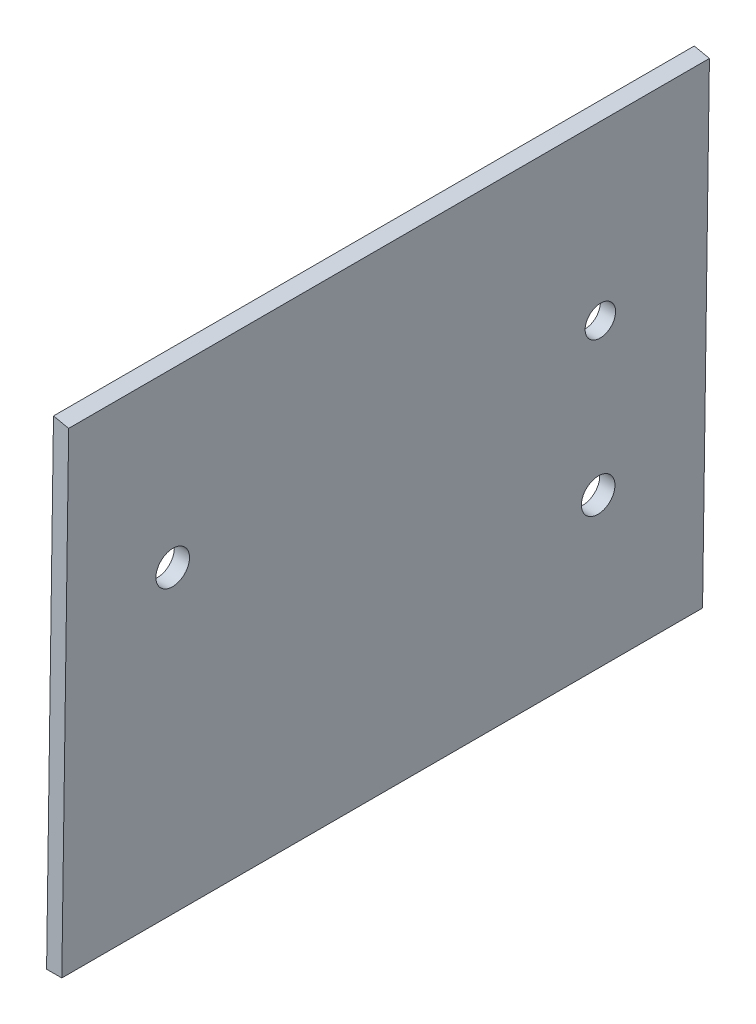
ISO-10303-21;
HEADER;
FILE_DESCRIPTION(('STEP AP214'),'2;1');
FILE_NAME('part.step','',(''),(''),'','','');
FILE_SCHEMA(('AUTOMOTIVE_DESIGN { 1 0 10303 214 1 1 1 1 }'));
ENDSEC;
DATA;
#1=APPLICATION_CONTEXT('core data for automotive mechanical design processes');
#2=APPLICATION_PROTOCOL_DEFINITION('international standard','automotive_design',2000,#1);
#3=PRODUCT_CONTEXT('',#1,'mechanical');
#4=PRODUCT('Part','Part','',(#3));
#5=PRODUCT_RELATED_PRODUCT_CATEGORY('part','',(#4));
#6=PRODUCT_DEFINITION_FORMATION('','',#4);
#7=PRODUCT_DEFINITION_CONTEXT('part definition',#1,'design');
#8=PRODUCT_DEFINITION('design','',#6,#7);
#9=PRODUCT_DEFINITION_SHAPE('','',#8);
#10=(LENGTH_UNIT() NAMED_UNIT(*) SI_UNIT(.MILLI.,.METRE.));
#11=(NAMED_UNIT(*) PLANE_ANGLE_UNIT() SI_UNIT($,.RADIAN.));
#12=(NAMED_UNIT(*) SI_UNIT($,.STERADIAN.) SOLID_ANGLE_UNIT());
#13=UNCERTAINTY_MEASURE_WITH_UNIT(LENGTH_MEASURE(1.E-05),#10,'distance_accuracy_value','');
#14=(GEOMETRIC_REPRESENTATION_CONTEXT(3) GLOBAL_UNCERTAINTY_ASSIGNED_CONTEXT((#13)) GLOBAL_UNIT_ASSIGNED_CONTEXT((#10,
#11,#12)) REPRESENTATION_CONTEXT('',''));
#15=CARTESIAN_POINT('',(0.,0.,0.));
#16=DIRECTION('',(0.,0.,1.));
#17=DIRECTION('',(1.,0.,0.));
#18=AXIS2_PLACEMENT_3D('',#15,#16,#17);
#19=CARTESIAN_POINT('',(12.7,0.,534.6));
#20=DIRECTION('',(0.,1.,0.));
#21=DIRECTION('',(-1.,0.,0.));
#22=AXIS2_PLACEMENT_3D('',#19,#20,#21);
#23=PLANE('',#22);
#24=DIRECTION('',(1.,0.,0.));
#25=VECTOR('',#24,1.);
#26=CARTESIAN_POINT('',(12.7,0.,0.));
#27=LINE('',#26,#25);
#28=CARTESIAN_POINT('',(0.,0.,0.));
#29=VERTEX_POINT('',#28);
#30=CARTESIAN_POINT('',(12.7,0.,0.));
#31=VERTEX_POINT('',#30);
#32=EDGE_CURVE('E109',#29,#31,#27,.T.);
#33=ORIENTED_EDGE('',*,*,#32,.T.);
#34=DIRECTION('',(0.,0.,-1.));
#35=VECTOR('',#34,1.);
#36=CARTESIAN_POINT('',(12.7,0.,534.6));
#37=LINE('',#36,#35);
#38=CARTESIAN_POINT('',(12.7,0.,534.6));
#39=VERTEX_POINT('',#38);
#40=EDGE_CURVE('E11',#39,#31,#37,.T.);
#41=ORIENTED_EDGE('',*,*,#40,.F.);
#42=DIRECTION('',(1.,0.,0.));
#43=VECTOR('',#42,1.);
#44=CARTESIAN_POINT('',(12.7,0.,534.6));
#45=LINE('',#44,#43);
#46=CARTESIAN_POINT('',(0.,0.,534.6));
#47=VERTEX_POINT('',#46);
#48=EDGE_CURVE('E92',#47,#39,#45,.T.);
#49=ORIENTED_EDGE('',*,*,#48,.F.);
#50=DIRECTION('',(0.,0.,-1.));
#51=VECTOR('',#50,1.);
#52=CARTESIAN_POINT('',(0.,0.,534.6));
#53=LINE('',#52,#51);
#54=EDGE_CURVE('E105',#47,#29,#53,.T.);
#55=ORIENTED_EDGE('',*,*,#54,.T.);
#56=EDGE_LOOP('',(#33,#41,#49,#55));
#57=FACE_BOUND('',#56,.T.);
#58=ADVANCED_FACE('F38',(#57),#23,.F.);
#59=CARTESIAN_POINT('',(18.4247477653538,400.,534.6));
#60=DIRECTION('',(-0.99989760092745,0.01431040389123,0.));
#61=DIRECTION('',(-0.01431040389123,-0.99989760092745,0.));
#62=AXIS2_PLACEMENT_3D('',#59,#60,#61);
#63=PLANE('',#62);
#64=CARTESIAN_POINT('',(16.3348425883724,253.973990635572,445.7));
#65=DIRECTION('',(0.99989760092745,-0.01431040389123,0.));
#66=DIRECTION('',(0.01431040389123,0.99989760092745,0.));
#67=AXIS2_PLACEMENT_3D('',#64,#65,#66);
#68=CIRCLE('',#67,14.);
#69=CARTESIAN_POINT('',(16.5351882428496,267.972557048557,445.7));
#70=VERTEX_POINT('',#69);
#71=EDGE_CURVE('E143',#70,#70,#68,.T.);
#72=ORIENTED_EDGE('',*,*,#71,.F.);
#73=EDGE_LOOP('',(#72));
#74=FACE_BOUND('',#73,.T.);
#75=CARTESIAN_POINT('',(14.5174212941862,126.986995317786,88.9));
#76=DIRECTION('',(0.99989760092745,-0.01431040389123,0.));
#77=DIRECTION('',(0.01431040389123,0.99989760092745,0.));
#78=AXIS2_PLACEMENT_3D('',#75,#76,#77);
#79=CIRCLE('',#78,14.);
#80=CARTESIAN_POINT('',(14.7177669486634,140.98556173077,88.9));
#81=VERTEX_POINT('',#80);
#82=EDGE_CURVE('E130',#81,#81,#79,.T.);
#83=ORIENTED_EDGE('',*,*,#82,.F.);
#84=EDGE_LOOP('',(#83));
#85=FACE_BOUND('',#84,.T.);
#86=CARTESIAN_POINT('',(16.3348425883724,253.973990635572,88.9));
#87=DIRECTION('',(0.99989760092745,-0.01431040389123,0.));
#88=DIRECTION('',(0.01431040389123,0.99989760092745,0.));
#89=AXIS2_PLACEMENT_3D('',#86,#87,#88);
#90=CIRCLE('',#89,12.7);
#91=CARTESIAN_POINT('',(16.516584717791,266.672690167351,88.9));
#92=VERTEX_POINT('',#91);
#93=EDGE_CURVE('E126',#92,#92,#90,.T.);
#94=ORIENTED_EDGE('',*,*,#93,.F.);
#95=EDGE_LOOP('',(#94));
#96=FACE_BOUND('',#95,.T.);
#97=DIRECTION('',(0.01431040389123,0.99989760092745,0.));
#98=VECTOR('',#97,1.);
#99=CARTESIAN_POINT('',(18.4247477653538,400.,0.));
#100=LINE('',#99,#98);
#101=CARTESIAN_POINT('',(18.4247477653538,400.,0.));
#102=VERTEX_POINT('',#101);
#103=EDGE_CURVE('E97',#31,#102,#100,.T.);
#104=ORIENTED_EDGE('',*,*,#103,.T.);
#105=DIRECTION('',(0.,0.,-1.));
#106=VECTOR('',#105,1.);
#107=CARTESIAN_POINT('',(18.4247477653538,400.,534.6));
#108=LINE('',#107,#106);
#109=CARTESIAN_POINT('',(18.4247477653538,400.,534.6));
#110=VERTEX_POINT('',#109);
#111=EDGE_CURVE('E48',#110,#102,#108,.T.);
#112=ORIENTED_EDGE('',*,*,#111,.F.);
#113=DIRECTION('',(0.01431040389123,0.99989760092745,0.));
#114=VECTOR('',#113,1.);
#115=CARTESIAN_POINT('',(18.4247477653538,400.,534.6));
#116=LINE('',#115,#114);
#117=EDGE_CURVE('E87',#39,#110,#116,.T.);
#118=ORIENTED_EDGE('',*,*,#117,.F.);
#119=ORIENTED_EDGE('',*,*,#40,.T.);
#120=EDGE_LOOP('',(#104,#112,#118,#119));
#121=FACE_BOUND('',#120,.T.);
#122=ADVANCED_FACE('F96',(#74,#85,#96,#121),#63,.F.);
#123=CARTESIAN_POINT('',(5.7626720424681,402.649847900297,534.6));
#124=DIRECTION('',(-0.204836938178128,-0.978796111944572,0.));
#125=DIRECTION('',(0.978796111944571,-0.204836938178128,0.));
#126=AXIS2_PLACEMENT_3D('',#123,#124,#125);
#127=PLANE('',#126);
#128=DIRECTION('',(-0.978796111944571,0.204836938178128,0.));
#129=VECTOR('',#128,1.);
#130=CARTESIAN_POINT('',(5.7626720424681,402.649847900297,0.));
#131=LINE('',#130,#129);
#132=CARTESIAN_POINT('',(5.7626720424681,402.649847900297,0.));
#133=VERTEX_POINT('',#132);
#134=EDGE_CURVE('E74',#102,#133,#131,.T.);
#135=ORIENTED_EDGE('',*,*,#134,.T.);
#136=DIRECTION('',(0.,0.,-1.));
#137=VECTOR('',#136,1.);
#138=CARTESIAN_POINT('',(5.7626720424681,402.649847900297,534.6));
#139=LINE('',#138,#137);
#140=CARTESIAN_POINT('',(5.7626720424681,402.649847900297,534.6));
#141=VERTEX_POINT('',#140);
#142=EDGE_CURVE('E99',#141,#133,#139,.T.);
#143=ORIENTED_EDGE('',*,*,#142,.F.);
#144=DIRECTION('',(-0.978796111944571,0.204836938178128,0.));
#145=VECTOR('',#144,1.);
#146=CARTESIAN_POINT('',(5.7626720424681,402.649847900297,534.6));
#147=LINE('',#146,#145);
#148=EDGE_CURVE('E90',#110,#141,#147,.T.);
#149=ORIENTED_EDGE('',*,*,#148,.F.);
#150=ORIENTED_EDGE('',*,*,#111,.T.);
#151=EDGE_LOOP('',(#135,#143,#149,#150));
#152=FACE_BOUND('',#151,.T.);
#153=ADVANCED_FACE('F101',(#152),#127,.F.);
#154=CARTESIAN_POINT('',(0.,0.,534.6));
#155=DIRECTION('',(0.99989760092745,-0.0143104038912299,0.));
#156=DIRECTION('',(0.0143104038912299,0.99989760092745,0.));
#157=AXIS2_PLACEMENT_3D('',#154,#155,#156);
#158=PLANE('',#157);
#159=CARTESIAN_POINT('',(3.63744339164842,254.155714154766,445.7));
#160=DIRECTION('',(0.99989760092745,-0.0143104038912299,0.));
#161=DIRECTION('',(0.0143104038912299,0.99989760092745,0.));
#162=AXIS2_PLACEMENT_3D('',#159,#160,#161);
#163=CIRCLE('',#162,14.);
#164=CARTESIAN_POINT('',(3.83778904612564,268.15428056775,445.7));
#165=VERTEX_POINT('',#164);
#166=EDGE_CURVE('E41',#165,#165,#163,.T.);
#167=ORIENTED_EDGE('',*,*,#166,.T.);
#168=EDGE_LOOP('',(#167));
#169=FACE_BOUND('',#168,.T.);
#170=CARTESIAN_POINT('',(1.82002209746223,127.168718836979,88.9));
#171=DIRECTION('',(0.99989760092745,-0.0143104038912299,0.));
#172=DIRECTION('',(0.0143104038912299,0.99989760092745,0.));
#173=AXIS2_PLACEMENT_3D('',#170,#171,#172);
#174=CIRCLE('',#173,14.);
#175=CARTESIAN_POINT('',(2.02036775193945,141.167285249964,88.9));
#176=VERTEX_POINT('',#175);
#177=EDGE_CURVE('E127',#176,#176,#174,.T.);
#178=ORIENTED_EDGE('',*,*,#177,.T.);
#179=EDGE_LOOP('',(#178));
#180=FACE_BOUND('',#179,.T.);
#181=CARTESIAN_POINT('',(3.63744339164842,254.155714154766,88.9));
#182=DIRECTION('',(0.99989760092745,-0.0143104038912299,0.));
#183=DIRECTION('',(0.0143104038912299,0.99989760092745,0.));
#184=AXIS2_PLACEMENT_3D('',#181,#182,#183);
#185=CIRCLE('',#184,12.7);
#186=CARTESIAN_POINT('',(3.81918552106704,266.854413686544,88.9));
#187=VERTEX_POINT('',#186);
#188=EDGE_CURVE('E113',#187,#187,#185,.T.);
#189=ORIENTED_EDGE('',*,*,#188,.T.);
#190=EDGE_LOOP('',(#189));
#191=FACE_BOUND('',#190,.T.);
#192=DIRECTION('',(-0.0143104038912299,-0.99989760092745,0.));
#193=VECTOR('',#192,1.);
#194=CARTESIAN_POINT('',(0.,0.,0.));
#195=LINE('',#194,#193);
#196=EDGE_CURVE('E80',#133,#29,#195,.T.);
#197=ORIENTED_EDGE('',*,*,#196,.T.);
#198=ORIENTED_EDGE('',*,*,#54,.F.);
#199=DIRECTION('',(-0.0143104038912299,-0.99989760092745,0.));
#200=VECTOR('',#199,1.);
#201=CARTESIAN_POINT('',(0.,0.,534.6));
#202=LINE('',#201,#200);
#203=EDGE_CURVE('E57',#141,#47,#202,.T.);
#204=ORIENTED_EDGE('',*,*,#203,.F.);
#205=ORIENTED_EDGE('',*,*,#142,.T.);
#206=EDGE_LOOP('',(#197,#198,#204,#205));
#207=FACE_BOUND('',#206,.T.);
#208=ADVANCED_FACE('F166',(#169,#180,#191,#207),#158,.F.);
#209=CARTESIAN_POINT('',(0.,0.,534.6));
#210=DIRECTION('',(0.,0.,-1.));
#211=DIRECTION('',(-1.,0.,0.));
#212=AXIS2_PLACEMENT_3D('',#209,#210,#211);
#213=PLANE('',#212);
#214=ORIENTED_EDGE('',*,*,#48,.T.);
#215=ORIENTED_EDGE('',*,*,#117,.T.);
#216=ORIENTED_EDGE('',*,*,#148,.T.);
#217=ORIENTED_EDGE('',*,*,#203,.T.);
#218=EDGE_LOOP('',(#214,#215,#216,#217));
#219=FACE_BOUND('',#218,.T.);
#220=ADVANCED_FACE('F88',(#219),#213,.F.);
#221=CARTESIAN_POINT('',(0.,0.,0.));
#222=DIRECTION('',(0.,0.,-1.));
#223=DIRECTION('',(-1.,0.,0.));
#224=AXIS2_PLACEMENT_3D('',#221,#222,#223);
#225=PLANE('',#224);
#226=ORIENTED_EDGE('',*,*,#32,.F.);
#227=ORIENTED_EDGE('',*,*,#196,.F.);
#228=ORIENTED_EDGE('',*,*,#134,.F.);
#229=ORIENTED_EDGE('',*,*,#103,.F.);
#230=EDGE_LOOP('',(#226,#227,#228,#229));
#231=FACE_BOUND('',#230,.T.);
#232=ADVANCED_FACE('F162',(#231),#225,.T.);
#233=CARTESIAN_POINT('',(-1.95128473738878,254.235699301935,88.9));
#234=DIRECTION('',(0.99989760092745,-0.01431040389123,0.));
#235=DIRECTION('',(0.01431040389123,0.99989760092745,0.));
#236=AXIS2_PLACEMENT_3D('',#233,#234,#235);
#237=CYLINDRICAL_SURFACE('',#236,12.7);
#238=ORIENTED_EDGE('',*,*,#93,.T.);
#239=EDGE_LOOP('',(#238));
#240=FACE_BOUND('',#239,.T.);
#241=ORIENTED_EDGE('',*,*,#188,.F.);
#242=EDGE_LOOP('',(#241));
#243=FACE_BOUND('',#242,.T.);
#244=ADVANCED_FACE('F158',(#240,#243),#237,.F.);
#245=CARTESIAN_POINT('',(-3.76870603157499,127.248703984149,88.9));
#246=DIRECTION('',(0.99989760092745,-0.01431040389123,0.));
#247=DIRECTION('',(0.01431040389123,0.99989760092745,0.));
#248=AXIS2_PLACEMENT_3D('',#245,#246,#247);
#249=CYLINDRICAL_SURFACE('',#248,14.);
#250=ORIENTED_EDGE('',*,*,#82,.T.);
#251=EDGE_LOOP('',(#250));
#252=FACE_BOUND('',#251,.T.);
#253=ORIENTED_EDGE('',*,*,#177,.F.);
#254=EDGE_LOOP('',(#253));
#255=FACE_BOUND('',#254,.T.);
#256=ADVANCED_FACE('F161',(#252,#255),#249,.F.);
#257=CARTESIAN_POINT('',(-1.95128473738878,254.235699301935,445.7));
#258=DIRECTION('',(0.99989760092745,-0.01431040389123,0.));
#259=DIRECTION('',(0.01431040389123,0.99989760092745,0.));
#260=AXIS2_PLACEMENT_3D('',#257,#258,#259);
#261=CYLINDRICAL_SURFACE('',#260,14.);
#262=ORIENTED_EDGE('',*,*,#71,.T.);
#263=EDGE_LOOP('',(#262));
#264=FACE_BOUND('',#263,.T.);
#265=ORIENTED_EDGE('',*,*,#166,.F.);
#266=EDGE_LOOP('',(#265));
#267=FACE_BOUND('',#266,.T.);
#268=ADVANCED_FACE('F150',(#264,#267),#261,.F.);
#269=CLOSED_SHELL('',(#58,#122,#153,#208,#220,#232,#244,#256,#268));
#270=MANIFOLD_SOLID_BREP('B2',#269);
#271=ADVANCED_BREP_SHAPE_REPRESENTATION('',(#18,#270),#14);
#272=SHAPE_DEFINITION_REPRESENTATION(#9,#271);
ENDSEC;
END-ISO-10303-21;
